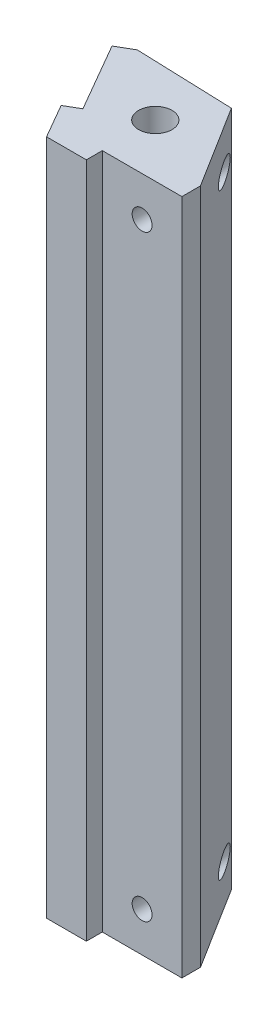
ISO-10303-21;
HEADER;
FILE_DESCRIPTION(('STEP AP214'),'2;1');
FILE_NAME('part.step','',(''),(''),'','','');
FILE_SCHEMA(('AUTOMOTIVE_DESIGN { 1 0 10303 214 1 1 1 1 }'));
ENDSEC;
DATA;
#1=APPLICATION_CONTEXT('core data for automotive mechanical design processes');
#2=APPLICATION_PROTOCOL_DEFINITION('international standard','automotive_design',2000,#1);
#3=PRODUCT_CONTEXT('',#1,'mechanical');
#4=PRODUCT('Part','Part','',(#3));
#5=PRODUCT_RELATED_PRODUCT_CATEGORY('part','',(#4));
#6=PRODUCT_DEFINITION_FORMATION('','',#4);
#7=PRODUCT_DEFINITION_CONTEXT('part definition',#1,'design');
#8=PRODUCT_DEFINITION('design','',#6,#7);
#9=PRODUCT_DEFINITION_SHAPE('','',#8);
#10=(LENGTH_UNIT() NAMED_UNIT(*) SI_UNIT(.MILLI.,.METRE.));
#11=(NAMED_UNIT(*) PLANE_ANGLE_UNIT() SI_UNIT($,.RADIAN.));
#12=(NAMED_UNIT(*) SI_UNIT($,.STERADIAN.) SOLID_ANGLE_UNIT());
#13=UNCERTAINTY_MEASURE_WITH_UNIT(LENGTH_MEASURE(1.E-05),#10,'distance_accuracy_value','');
#14=(GEOMETRIC_REPRESENTATION_CONTEXT(3) GLOBAL_UNCERTAINTY_ASSIGNED_CONTEXT((#13)) GLOBAL_UNIT_ASSIGNED_CONTEXT((#10,
#11,#12)) REPRESENTATION_CONTEXT('',''));
#15=CARTESIAN_POINT('',(0.,0.,0.));
#16=DIRECTION('',(0.,0.,1.));
#17=DIRECTION('',(1.,0.,0.));
#18=AXIS2_PLACEMENT_3D('',#15,#16,#17);
#19=CARTESIAN_POINT('',(0.,85.,0.));
#20=DIRECTION('',(0.866025403784436,0.,-0.500000000000004));
#21=DIRECTION('',(-0.500000000000004,0.,-0.866025403784436));
#22=AXIS2_PLACEMENT_3D('',#19,#20,#21);
#23=PLANE('',#22);
#24=DIRECTION('',(0.500000000000004,0.,0.866025403784436));
#25=VECTOR('',#24,1.);
#26=CARTESIAN_POINT('',(0.,85.,0.));
#27=LINE('',#26,#25);
#28=CARTESIAN_POINT('',(-2.50000000000031,85.,-4.3301270189223));
#29=VERTEX_POINT('',#28);
#30=CARTESIAN_POINT('',(0.,85.,0.));
#31=VERTEX_POINT('',#30);
#32=EDGE_CURVE('E217',#29,#31,#27,.T.);
#33=ORIENTED_EDGE('',*,*,#32,.F.);
#34=DIRECTION('',(0.,1.,0.));
#35=VECTOR('',#34,1.);
#36=CARTESIAN_POINT('',(-2.50000000000031,0.,-4.3301270189223));
#37=LINE('',#36,#35);
#38=CARTESIAN_POINT('',(-2.50000000000031,0.,-4.3301270189223));
#39=VERTEX_POINT('',#38);
#40=EDGE_CURVE('E201',#39,#29,#37,.T.);
#41=ORIENTED_EDGE('',*,*,#40,.F.);
#42=DIRECTION('',(0.500000000000004,0.,0.866025403784436));
#43=VECTOR('',#42,1.);
#44=CARTESIAN_POINT('',(0.,0.,0.));
#45=LINE('',#44,#43);
#46=CARTESIAN_POINT('',(0.,0.,0.));
#47=VERTEX_POINT('',#46);
#48=EDGE_CURVE('E211',#39,#47,#45,.T.);
#49=ORIENTED_EDGE('',*,*,#48,.T.);
#50=DIRECTION('',(0.,-1.,0.));
#51=VECTOR('',#50,1.);
#52=CARTESIAN_POINT('',(0.,85.,0.));
#53=LINE('',#52,#51);
#54=EDGE_CURVE('E13',#31,#47,#53,.T.);
#55=ORIENTED_EDGE('',*,*,#54,.F.);
#56=EDGE_LOOP('',(#33,#41,#49,#55));
#57=FACE_BOUND('',#56,.T.);
#58=ADVANCED_FACE('F60',(#57),#23,.F.);
#59=CARTESIAN_POINT('',(0.,85.,0.));
#60=DIRECTION('',(0.,0.,-1.));
#61=DIRECTION('',(-1.,0.,0.));
#62=AXIS2_PLACEMENT_3D('',#59,#60,#61);
#63=PLANE('',#62);
#64=DIRECTION('',(1.,0.,0.));
#65=VECTOR('',#64,1.);
#66=CARTESIAN_POINT('',(0.,0.,0.));
#67=LINE('',#66,#65);
#68=CARTESIAN_POINT('',(5.,0.,0.));
#69=VERTEX_POINT('',#68);
#70=EDGE_CURVE('E241',#47,#69,#67,.T.);
#71=ORIENTED_EDGE('',*,*,#70,.T.);
#72=DIRECTION('',(0.,1.,0.));
#73=VECTOR('',#72,1.);
#74=CARTESIAN_POINT('',(5.,0.,0.));
#75=LINE('',#74,#73);
#76=CARTESIAN_POINT('',(5.,85.,0.));
#77=VERTEX_POINT('',#76);
#78=EDGE_CURVE('E184',#69,#77,#75,.T.);
#79=ORIENTED_EDGE('',*,*,#78,.T.);
#80=DIRECTION('',(1.,0.,0.));
#81=VECTOR('',#80,1.);
#82=CARTESIAN_POINT('',(0.,85.,0.));
#83=LINE('',#82,#81);
#84=EDGE_CURVE('E220',#31,#77,#83,.T.);
#85=ORIENTED_EDGE('',*,*,#84,.F.);
#86=ORIENTED_EDGE('',*,*,#54,.T.);
#87=EDGE_LOOP('',(#71,#79,#85,#86));
#88=FACE_BOUND('',#87,.T.);
#89=ADVANCED_FACE('F300',(#88),#63,.F.);
#90=CARTESIAN_POINT('',(15.,85.,0.));
#91=DIRECTION('',(-1.,0.,0.));
#92=DIRECTION('',(0.,0.,1.));
#93=AXIS2_PLACEMENT_3D('',#90,#91,#92);
#94=PLANE('',#93);
#95=DIRECTION('',(0.,0.,-1.));
#96=VECTOR('',#95,1.);
#97=CARTESIAN_POINT('',(15.,85.,0.));
#98=LINE('',#97,#96);
#99=CARTESIAN_POINT('',(15.,85.,-2.));
#100=VERTEX_POINT('',#99);
#101=CARTESIAN_POINT('',(15.,85.,-4.3301270189222));
#102=VERTEX_POINT('',#101);
#103=EDGE_CURVE('E225',#100,#102,#98,.T.);
#104=ORIENTED_EDGE('',*,*,#103,.F.);
#105=DIRECTION('',(0.,1.,0.));
#106=VECTOR('',#105,1.);
#107=CARTESIAN_POINT('',(15.,0.,-2.));
#108=LINE('',#107,#106);
#109=CARTESIAN_POINT('',(15.,0.,-2.));
#110=VERTEX_POINT('',#109);
#111=EDGE_CURVE('E178',#110,#100,#108,.T.);
#112=ORIENTED_EDGE('',*,*,#111,.F.);
#113=DIRECTION('',(0.,0.,-1.));
#114=VECTOR('',#113,1.);
#115=CARTESIAN_POINT('',(15.,0.,0.));
#116=LINE('',#115,#114);
#117=CARTESIAN_POINT('',(15.,0.,-4.3301270189222));
#118=VERTEX_POINT('',#117);
#119=EDGE_CURVE('E245',#110,#118,#116,.T.);
#120=ORIENTED_EDGE('',*,*,#119,.T.);
#121=DIRECTION('',(0.,-1.,0.));
#122=VECTOR('',#121,1.);
#123=CARTESIAN_POINT('',(15.,85.,-4.3301270189222));
#124=LINE('',#123,#122);
#125=EDGE_CURVE('E69',#102,#118,#124,.T.);
#126=ORIENTED_EDGE('',*,*,#125,.F.);
#127=EDGE_LOOP('',(#104,#112,#120,#126));
#128=FACE_BOUND('',#127,.T.);
#129=ADVANCED_FACE('F294',(#128),#94,.F.);
#130=CARTESIAN_POINT('',(8.49999999999996,85.,-14.7224318643355));
#131=DIRECTION('',(-0.847821913300318,0.,0.530281060691204));
#132=DIRECTION('',(0.530281060691204,0.,0.847821913300318));
#133=AXIS2_PLACEMENT_3D('',#130,#131,#132);
#134=PLANE('',#133);
#135=CARTESIAN_POINT('',(10.,80.,-12.3242076692401));
#136=DIRECTION('',(-0.847821913300318,0.,0.530281060691204));
#137=DIRECTION('',(0.530281060691204,0.,0.847821913300318));
#138=AXIS2_PLACEMENT_3D('',#135,#136,#137);
#139=ELLIPSE('',#138,2.35724051387138,1.24999999999999);
#140=CARTESIAN_POINT('',(11.25,80.,-10.3256875066606));
#141=VERTEX_POINT('',#140);
#142=EDGE_CURVE('E373',#141,#141,#139,.T.);
#143=ORIENTED_EDGE('',*,*,#142,.T.);
#144=EDGE_LOOP('',(#143));
#145=FACE_BOUND('',#144,.T.);
#146=CARTESIAN_POINT('',(10.,5.,-12.3242076692401));
#147=DIRECTION('',(-0.847821913300318,0.,0.530281060691204));
#148=DIRECTION('',(0.530281060691204,0.,0.847821913300318));
#149=AXIS2_PLACEMENT_3D('',#146,#147,#148);
#150=ELLIPSE('',#149,2.35724051387138,1.24999999999999);
#151=CARTESIAN_POINT('',(11.25,5.,-10.3256875066606));
#152=VERTEX_POINT('',#151);
#153=EDGE_CURVE('E372',#152,#152,#150,.T.);
#154=ORIENTED_EDGE('',*,*,#153,.T.);
#155=EDGE_LOOP('',(#154));
#156=FACE_BOUND('',#155,.T.);
#157=DIRECTION('',(-0.530281060691204,0.,-0.847821913300318));
#158=VECTOR('',#157,1.);
#159=CARTESIAN_POINT('',(8.49999999999996,0.,-14.7224318643355));
#160=LINE('',#159,#158);
#161=CARTESIAN_POINT('',(8.49999999999996,0.,-14.7224318643355));
#162=VERTEX_POINT('',#161);
#163=EDGE_CURVE('E248',#118,#162,#160,.T.);
#164=ORIENTED_EDGE('',*,*,#163,.T.);
#165=DIRECTION('',(0.,-1.,0.));
#166=VECTOR('',#165,1.);
#167=CARTESIAN_POINT('',(8.49999999999996,85.,-14.7224318643355));
#168=LINE('',#167,#166);
#169=CARTESIAN_POINT('',(8.49999999999996,85.,-14.7224318643355));
#170=VERTEX_POINT('',#169);
#171=EDGE_CURVE('E260',#170,#162,#168,.T.);
#172=ORIENTED_EDGE('',*,*,#171,.F.);
#173=DIRECTION('',(-0.530281060691204,0.,-0.847821913300318));
#174=VECTOR('',#173,1.);
#175=CARTESIAN_POINT('',(8.49999999999996,85.,-14.7224318643355));
#176=LINE('',#175,#174);
#177=EDGE_CURVE('E228',#102,#170,#176,.T.);
#178=ORIENTED_EDGE('',*,*,#177,.F.);
#179=ORIENTED_EDGE('',*,*,#125,.T.);
#180=EDGE_LOOP('',(#164,#172,#178,#179));
#181=FACE_BOUND('',#180,.T.);
#182=ADVANCED_FACE('F271',(#145,#156,#181),#134,.F.);
#183=CARTESIAN_POINT('',(-3.75000000000006,85.,-15.1554445662277));
#184=DIRECTION('',(-0.0353259130541768,0.,0.999375845148805));
#185=DIRECTION('',(0.999375845148805,0.,0.0353259130541768));
#186=AXIS2_PLACEMENT_3D('',#183,#184,#185);
#187=PLANE('',#186);
#188=CARTESIAN_POINT('',(5.67307692307649,80.,-14.8223578724645));
#189=DIRECTION('',(-0.0353259130541768,0.,0.999375845148805));
#190=DIRECTION('',(-0.999375845148805,0.,-0.0353259130541768));
#191=AXIS2_PLACEMENT_3D('',#188,#189,#190);
#192=ELLIPSE('',#191,2.3572405138714,1.24999999999999);
#193=CARTESIAN_POINT('',(3.31730769230726,80.,-14.9056295459053));
#194=VERTEX_POINT('',#193);
#195=EDGE_CURVE('E389',#194,#194,#192,.T.);
#196=ORIENTED_EDGE('',*,*,#195,.T.);
#197=EDGE_LOOP('',(#196));
#198=FACE_BOUND('',#197,.T.);
#199=CARTESIAN_POINT('',(5.67307692307649,5.,-14.8223578724645));
#200=DIRECTION('',(-0.0353259130541768,0.,0.999375845148805));
#201=DIRECTION('',(-0.999375845148805,0.,-0.0353259130541768));
#202=AXIS2_PLACEMENT_3D('',#199,#200,#201);
#203=ELLIPSE('',#202,2.35724051387139,1.24999999999999);
#204=CARTESIAN_POINT('',(3.31730769230726,5.,-14.9056295459053));
#205=VERTEX_POINT('',#204);
#206=EDGE_CURVE('E63',#205,#205,#203,.T.);
#207=ORIENTED_EDGE('',*,*,#206,.T.);
#208=EDGE_LOOP('',(#207));
#209=FACE_BOUND('',#208,.T.);
#210=DIRECTION('',(-0.999375845148805,0.,-0.0353259130541768));
#211=VECTOR('',#210,1.);
#212=CARTESIAN_POINT('',(-3.75000000000006,0.,-15.1554445662277));
#213=LINE('',#212,#211);
#214=CARTESIAN_POINT('',(-3.75000000000006,0.,-15.1554445662277));
#215=VERTEX_POINT('',#214);
#216=EDGE_CURVE('E251',#162,#215,#213,.T.);
#217=ORIENTED_EDGE('',*,*,#216,.T.);
#218=DIRECTION('',(0.,-1.,0.));
#219=VECTOR('',#218,1.);
#220=CARTESIAN_POINT('',(-3.75000000000006,85.,-15.1554445662277));
#221=LINE('',#220,#219);
#222=CARTESIAN_POINT('',(-3.75000000000006,85.,-15.1554445662277));
#223=VERTEX_POINT('',#222);
#224=EDGE_CURVE('E238',#223,#215,#221,.T.);
#225=ORIENTED_EDGE('',*,*,#224,.F.);
#226=DIRECTION('',(-0.999375845148805,0.,-0.0353259130541768));
#227=VECTOR('',#226,1.);
#228=CARTESIAN_POINT('',(-3.75000000000006,85.,-15.1554445662277));
#229=LINE('',#228,#227);
#230=EDGE_CURVE('E231',#170,#223,#229,.T.);
#231=ORIENTED_EDGE('',*,*,#230,.F.);
#232=ORIENTED_EDGE('',*,*,#171,.T.);
#233=EDGE_LOOP('',(#217,#225,#231,#232));
#234=FACE_BOUND('',#233,.T.);
#235=ADVANCED_FACE('F282',(#198,#209,#234),#187,.F.);
#236=CARTESIAN_POINT('',(-3.75000000000006,85.,-15.1554445662277));
#237=DIRECTION('',(0.500000000000015,0.,0.86602540378443));
#238=DIRECTION('',(0.86602540378443,0.,-0.500000000000015));
#239=AXIS2_PLACEMENT_3D('',#236,#237,#238);
#240=PLANE('',#239);
#241=DIRECTION('',(-0.86602540378443,0.,0.500000000000015));
#242=VECTOR('',#241,1.);
#243=CARTESIAN_POINT('',(-3.75000000000006,0.,-15.1554445662277));
#244=LINE('',#243,#242);
#245=CARTESIAN_POINT('',(-5.76794919243139,0.,-13.9903810567666));
#246=VERTEX_POINT('',#245);
#247=EDGE_CURVE('E221',#215,#246,#244,.T.);
#248=ORIENTED_EDGE('',*,*,#247,.T.);
#249=DIRECTION('',(0.,1.,0.));
#250=VECTOR('',#249,1.);
#251=CARTESIAN_POINT('',(-5.76794919243139,0.,-13.9903810567666));
#252=LINE('',#251,#250);
#253=CARTESIAN_POINT('',(-5.76794919243139,85.,-13.9903810567666));
#254=VERTEX_POINT('',#253);
#255=EDGE_CURVE('E207',#246,#254,#252,.T.);
#256=ORIENTED_EDGE('',*,*,#255,.T.);
#257=DIRECTION('',(-0.86602540378443,0.,0.500000000000015));
#258=VECTOR('',#257,1.);
#259=CARTESIAN_POINT('',(-3.75000000000006,85.,-15.1554445662277));
#260=LINE('',#259,#258);
#261=EDGE_CURVE('E234',#223,#254,#260,.T.);
#262=ORIENTED_EDGE('',*,*,#261,.F.);
#263=ORIENTED_EDGE('',*,*,#224,.T.);
#264=EDGE_LOOP('',(#248,#256,#262,#263));
#265=FACE_BOUND('',#264,.T.);
#266=ADVANCED_FACE('F286',(#265),#240,.F.);
#267=CARTESIAN_POINT('',(0.,85.,0.));
#268=DIRECTION('',(0.,1.,0.));
#269=DIRECTION('',(0.,0.,1.));
#270=AXIS2_PLACEMENT_3D('',#267,#268,#269);
#271=PLANE('',#270);
#272=CARTESIAN_POINT('',(4.99999999999998,85.,-8.6602540378444));
#273=DIRECTION('',(0.,1.,0.));
#274=DIRECTION('',(0.,0.,1.));
#275=AXIS2_PLACEMENT_3D('',#272,#273,#274);
#276=CIRCLE('',#275,2.09999999999999);
#277=CARTESIAN_POINT('',(4.99999999999998,85.,-6.56025403784441));
#278=VERTEX_POINT('',#277);
#279=EDGE_CURVE('E155',#278,#278,#276,.T.);
#280=ORIENTED_EDGE('',*,*,#279,.F.);
#281=EDGE_LOOP('',(#280));
#282=FACE_BOUND('',#281,.T.);
#283=DIRECTION('',(0.,0.,1.));
#284=VECTOR('',#283,1.);
#285=CARTESIAN_POINT('',(5.,85.,-2.));
#286=LINE('',#285,#284);
#287=CARTESIAN_POINT('',(5.,85.,-2.));
#288=VERTEX_POINT('',#287);
#289=EDGE_CURVE('E175',#288,#77,#286,.T.);
#290=ORIENTED_EDGE('',*,*,#289,.F.);
#291=DIRECTION('',(-1.,0.,0.));
#292=VECTOR('',#291,1.);
#293=CARTESIAN_POINT('',(15.,85.,-2.));
#294=LINE('',#293,#292);
#295=EDGE_CURVE('E170',#100,#288,#294,.T.);
#296=ORIENTED_EDGE('',*,*,#295,.F.);
#297=ORIENTED_EDGE('',*,*,#103,.T.);
#298=ORIENTED_EDGE('',*,*,#177,.T.);
#299=ORIENTED_EDGE('',*,*,#230,.T.);
#300=ORIENTED_EDGE('',*,*,#261,.T.);
#301=DIRECTION('',(-0.5,0.,-0.866025403784439));
#302=VECTOR('',#301,1.);
#303=CARTESIAN_POINT('',(-5.76794919243139,85.,-13.9903810567666));
#304=LINE('',#303,#302);
#305=CARTESIAN_POINT('',(-0.767949192431417,85.,-5.33012701892222));
#306=VERTEX_POINT('',#305);
#307=EDGE_CURVE('E198',#306,#254,#304,.T.);
#308=ORIENTED_EDGE('',*,*,#307,.F.);
#309=DIRECTION('',(0.866025403784457,0.,-0.499999999999969));
#310=VECTOR('',#309,1.);
#311=CARTESIAN_POINT('',(-0.767949192431417,85.,-5.33012701892222));
#312=LINE('',#311,#310);
#313=EDGE_CURVE('E188',#29,#306,#312,.T.);
#314=ORIENTED_EDGE('',*,*,#313,.F.);
#315=ORIENTED_EDGE('',*,*,#32,.T.);
#316=ORIENTED_EDGE('',*,*,#84,.T.);
#317=EDGE_LOOP('',(#290,#296,#297,#298,#299,#300,#308,#314,#315,#316));
#318=FACE_BOUND('',#317,.T.);
#319=ADVANCED_FACE('F290',(#282,#318),#271,.T.);
#320=CARTESIAN_POINT('',(0.,0.,0.));
#321=DIRECTION('',(0.,1.,0.));
#322=DIRECTION('',(0.,0.,1.));
#323=AXIS2_PLACEMENT_3D('',#320,#321,#322);
#324=PLANE('',#323);
#325=CARTESIAN_POINT('',(4.99999999999998,0.,-8.6602540378444));
#326=DIRECTION('',(0.,-1.,0.));
#327=DIRECTION('',(0.,0.,-1.));
#328=AXIS2_PLACEMENT_3D('',#325,#326,#327);
#329=CIRCLE('',#328,2.09999999999999);
#330=CARTESIAN_POINT('',(4.99999999999998,0.,-10.7602540378444));
#331=VERTEX_POINT('',#330);
#332=EDGE_CURVE('E156',#331,#331,#329,.T.);
#333=ORIENTED_EDGE('',*,*,#332,.F.);
#334=EDGE_LOOP('',(#333));
#335=FACE_BOUND('',#334,.T.);
#336=DIRECTION('',(-1.,0.,0.));
#337=VECTOR('',#336,1.);
#338=CARTESIAN_POINT('',(15.,0.,-2.));
#339=LINE('',#338,#337);
#340=CARTESIAN_POINT('',(5.,0.,-2.));
#341=VERTEX_POINT('',#340);
#342=EDGE_CURVE('E171',#110,#341,#339,.T.);
#343=ORIENTED_EDGE('',*,*,#342,.T.);
#344=DIRECTION('',(0.,0.,1.));
#345=VECTOR('',#344,1.);
#346=CARTESIAN_POINT('',(5.,0.,-2.));
#347=LINE('',#346,#345);
#348=EDGE_CURVE('E76',#341,#69,#347,.T.);
#349=ORIENTED_EDGE('',*,*,#348,.T.);
#350=ORIENTED_EDGE('',*,*,#70,.F.);
#351=ORIENTED_EDGE('',*,*,#48,.F.);
#352=DIRECTION('',(0.866025403784457,0.,-0.499999999999969));
#353=VECTOR('',#352,1.);
#354=CARTESIAN_POINT('',(-0.767949192431417,0.,-5.33012701892222));
#355=LINE('',#354,#353);
#356=CARTESIAN_POINT('',(-0.767949192431417,0.,-5.33012701892222));
#357=VERTEX_POINT('',#356);
#358=EDGE_CURVE('E194',#39,#357,#355,.T.);
#359=ORIENTED_EDGE('',*,*,#358,.T.);
#360=DIRECTION('',(-0.5,0.,-0.866025403784439));
#361=VECTOR('',#360,1.);
#362=CARTESIAN_POINT('',(-5.76794919243139,0.,-13.9903810567666));
#363=LINE('',#362,#361);
#364=EDGE_CURVE('E84',#357,#246,#363,.T.);
#365=ORIENTED_EDGE('',*,*,#364,.T.);
#366=ORIENTED_EDGE('',*,*,#247,.F.);
#367=ORIENTED_EDGE('',*,*,#216,.F.);
#368=ORIENTED_EDGE('',*,*,#163,.F.);
#369=ORIENTED_EDGE('',*,*,#119,.F.);
#370=EDGE_LOOP('',(#343,#349,#350,#351,#359,#365,#366,#367,#368,#369));
#371=FACE_BOUND('',#370,.T.);
#372=ADVANCED_FACE('F278',(#335,#371),#324,.F.);
#373=CARTESIAN_POINT('',(-5.76794919243139,0.,-13.9903810567666));
#374=DIRECTION('',(0.866025403784439,0.,-0.5));
#375=DIRECTION('',(-0.5,0.,-0.866025403784439));
#376=AXIS2_PLACEMENT_3D('',#373,#374,#375);
#377=PLANE('',#376);
#378=CARTESIAN_POINT('',(-3.26794919243145,80.,-9.66025403784447));
#379=DIRECTION('',(-0.866025403784439,0.,0.5));
#380=DIRECTION('',(0.5,0.,0.866025403784439));
#381=AXIS2_PLACEMENT_3D('',#378,#379,#380);
#382=CIRCLE('',#381,1.24999999999999);
#383=CARTESIAN_POINT('',(-2.64294919243146,80.,-8.57772228311394));
#384=VERTEX_POINT('',#383);
#385=EDGE_CURVE('E379',#384,#384,#382,.T.);
#386=ORIENTED_EDGE('',*,*,#385,.F.);
#387=EDGE_LOOP('',(#386));
#388=FACE_BOUND('',#387,.T.);
#389=CARTESIAN_POINT('',(-3.26794919243145,5.,-9.66025403784447));
#390=DIRECTION('',(-0.866025403784439,0.,0.5));
#391=DIRECTION('',(0.5,0.,0.866025403784439));
#392=AXIS2_PLACEMENT_3D('',#389,#390,#391);
#393=CIRCLE('',#392,1.24999999999999);
#394=CARTESIAN_POINT('',(-2.64294919243146,5.,-8.57772228311394));
#395=VERTEX_POINT('',#394);
#396=EDGE_CURVE('E392',#395,#395,#393,.T.);
#397=ORIENTED_EDGE('',*,*,#396,.F.);
#398=EDGE_LOOP('',(#397));
#399=FACE_BOUND('',#398,.T.);
#400=ORIENTED_EDGE('',*,*,#307,.T.);
#401=ORIENTED_EDGE('',*,*,#255,.F.);
#402=ORIENTED_EDGE('',*,*,#364,.F.);
#403=DIRECTION('',(0.,1.,0.));
#404=VECTOR('',#403,1.);
#405=CARTESIAN_POINT('',(-0.767949192431417,0.,-5.33012701892222));
#406=LINE('',#405,#404);
#407=EDGE_CURVE('E212',#357,#306,#406,.T.);
#408=ORIENTED_EDGE('',*,*,#407,.T.);
#409=EDGE_LOOP('',(#400,#401,#402,#408));
#410=FACE_BOUND('',#409,.T.);
#411=ADVANCED_FACE('F308',(#388,#399,#410),#377,.F.);
#412=CARTESIAN_POINT('',(-0.767949192431417,0.,-5.33012701892222));
#413=DIRECTION('',(0.499999999999968,0.,0.866025403784457));
#414=DIRECTION('',(0.866025403784457,0.,-0.499999999999969));
#415=AXIS2_PLACEMENT_3D('',#412,#413,#414);
#416=PLANE('',#415);
#417=ORIENTED_EDGE('',*,*,#313,.T.);
#418=ORIENTED_EDGE('',*,*,#407,.F.);
#419=ORIENTED_EDGE('',*,*,#358,.F.);
#420=ORIENTED_EDGE('',*,*,#40,.T.);
#421=EDGE_LOOP('',(#417,#418,#419,#420));
#422=FACE_BOUND('',#421,.T.);
#423=ADVANCED_FACE('F307',(#422),#416,.F.);
#424=CARTESIAN_POINT('',(5.,0.,-2.));
#425=DIRECTION('',(-1.,0.,0.));
#426=DIRECTION('',(0.,0.,1.));
#427=AXIS2_PLACEMENT_3D('',#424,#425,#426);
#428=PLANE('',#427);
#429=ORIENTED_EDGE('',*,*,#289,.T.);
#430=ORIENTED_EDGE('',*,*,#78,.F.);
#431=ORIENTED_EDGE('',*,*,#348,.F.);
#432=DIRECTION('',(0.,1.,0.));
#433=VECTOR('',#432,1.);
#434=CARTESIAN_POINT('',(5.,0.,-2.));
#435=LINE('',#434,#433);
#436=EDGE_CURVE('E189',#341,#288,#435,.T.);
#437=ORIENTED_EDGE('',*,*,#436,.T.);
#438=EDGE_LOOP('',(#429,#430,#431,#437));
#439=FACE_BOUND('',#438,.T.);
#440=ADVANCED_FACE('F316',(#439),#428,.F.);
#441=CARTESIAN_POINT('',(15.,0.,-2.));
#442=DIRECTION('',(0.,0.,-1.));
#443=DIRECTION('',(-1.,0.,0.));
#444=AXIS2_PLACEMENT_3D('',#441,#442,#443);
#445=PLANE('',#444);
#446=CARTESIAN_POINT('',(10.,80.,-2.));
#447=DIRECTION('',(0.,0.,1.));
#448=DIRECTION('',(1.,0.,0.));
#449=AXIS2_PLACEMENT_3D('',#446,#447,#448);
#450=CIRCLE('',#449,1.24999999999999);
#451=CARTESIAN_POINT('',(11.25,80.,-2.));
#452=VERTEX_POINT('',#451);
#453=EDGE_CURVE('E366',#452,#452,#450,.T.);
#454=ORIENTED_EDGE('',*,*,#453,.F.);
#455=EDGE_LOOP('',(#454));
#456=FACE_BOUND('',#455,.T.);
#457=CARTESIAN_POINT('',(10.,5.,-2.));
#458=DIRECTION('',(0.,0.,1.));
#459=DIRECTION('',(1.,0.,0.));
#460=AXIS2_PLACEMENT_3D('',#457,#458,#459);
#461=CIRCLE('',#460,1.24999999999999);
#462=CARTESIAN_POINT('',(11.25,5.,-2.));
#463=VERTEX_POINT('',#462);
#464=EDGE_CURVE('E369',#463,#463,#461,.T.);
#465=ORIENTED_EDGE('',*,*,#464,.F.);
#466=EDGE_LOOP('',(#465));
#467=FACE_BOUND('',#466,.T.);
#468=ORIENTED_EDGE('',*,*,#295,.T.);
#469=ORIENTED_EDGE('',*,*,#436,.F.);
#470=ORIENTED_EDGE('',*,*,#342,.F.);
#471=ORIENTED_EDGE('',*,*,#111,.T.);
#472=EDGE_LOOP('',(#468,#469,#470,#471));
#473=FACE_BOUND('',#472,.T.);
#474=ADVANCED_FACE('F296',(#456,#467,#473),#445,.F.);
#475=CARTESIAN_POINT('',(4.99999999999998,69.,-8.6602540378444));
#476=DIRECTION('',(0.,1.,0.));
#477=DIRECTION('',(0.,0.,1.));
#478=AXIS2_PLACEMENT_3D('',#475,#476,#477);
#479=CONICAL_SURFACE('',#478,2.1,1.02974425867665);
#480=CARTESIAN_POINT('',(4.99999999999998,67.7381927000421,-8.6602540378444));
#481=VERTEX_POINT('',#480);
#482=VERTEX_LOOP('',#481);
#483=FACE_BOUND('',#482,.T.);
#484=CARTESIAN_POINT('',(4.99999999999998,69.,-8.6602540378444));
#485=DIRECTION('',(0.,1.,0.));
#486=DIRECTION('',(0.,0.,1.));
#487=AXIS2_PLACEMENT_3D('',#484,#485,#486);
#488=CIRCLE('',#487,2.1);
#489=CARTESIAN_POINT('',(4.99999999999998,69.,-6.5602540378444));
#490=VERTEX_POINT('',#489);
#491=EDGE_CURVE('E161',#490,#490,#488,.T.);
#492=ORIENTED_EDGE('',*,*,#491,.T.);
#493=EDGE_LOOP('',(#492));
#494=FACE_BOUND('',#493,.T.);
#495=ADVANCED_FACE('F347',(#483,#494),#479,.F.);
#496=CARTESIAN_POINT('',(4.99999999999998,85.,-8.6602540378444));
#497=DIRECTION('',(0.,1.,0.));
#498=DIRECTION('',(0.,0.,1.));
#499=AXIS2_PLACEMENT_3D('',#496,#497,#498);
#500=CYLINDRICAL_SURFACE('',#499,2.09999999999999);
#501=ORIENTED_EDGE('',*,*,#491,.F.);
#502=EDGE_LOOP('',(#501));
#503=FACE_BOUND('',#502,.T.);
#504=ORIENTED_EDGE('',*,*,#279,.T.);
#505=EDGE_LOOP('',(#504));
#506=FACE_BOUND('',#505,.T.);
#507=ADVANCED_FACE('F148',(#503,#506),#500,.F.);
#508=CARTESIAN_POINT('',(4.99999999999998,16.4,-8.6602540378444));
#509=DIRECTION('',(0.,-1.,0.));
#510=DIRECTION('',(0.,0.,-1.));
#511=AXIS2_PLACEMENT_3D('',#508,#509,#510);
#512=CONICAL_SURFACE('',#511,2.1,1.02974425867665);
#513=CARTESIAN_POINT('',(4.99999999999998,17.6618072999579,-8.6602540378444));
#514=VERTEX_POINT('',#513);
#515=VERTEX_LOOP('',#514);
#516=FACE_BOUND('',#515,.T.);
#517=CARTESIAN_POINT('',(4.99999999999998,16.4,-8.6602540378444));
#518=DIRECTION('',(0.,-1.,0.));
#519=DIRECTION('',(0.,0.,-1.));
#520=AXIS2_PLACEMENT_3D('',#517,#518,#519);
#521=CIRCLE('',#520,2.1);
#522=CARTESIAN_POINT('',(4.99999999999998,16.4,-10.7602540378444));
#523=VERTEX_POINT('',#522);
#524=EDGE_CURVE('E152',#523,#523,#521,.T.);
#525=ORIENTED_EDGE('',*,*,#524,.T.);
#526=EDGE_LOOP('',(#525));
#527=FACE_BOUND('',#526,.T.);
#528=ADVANCED_FACE('F144',(#516,#527),#512,.F.);
#529=CARTESIAN_POINT('',(4.99999999999998,0.,-8.6602540378444));
#530=DIRECTION('',(0.,-1.,0.));
#531=DIRECTION('',(0.,0.,-1.));
#532=AXIS2_PLACEMENT_3D('',#529,#530,#531);
#533=CYLINDRICAL_SURFACE('',#532,2.09999999999999);
#534=ORIENTED_EDGE('',*,*,#524,.F.);
#535=EDGE_LOOP('',(#534));
#536=FACE_BOUND('',#535,.T.);
#537=ORIENTED_EDGE('',*,*,#332,.T.);
#538=EDGE_LOOP('',(#537));
#539=FACE_BOUND('',#538,.T.);
#540=ADVANCED_FACE('F147',(#536,#539),#533,.F.);
#541=CARTESIAN_POINT('',(-3.26794919243145,5.,-9.66025403784447));
#542=DIRECTION('',(-0.866025403784439,0.,0.5));
#543=DIRECTION('',(0.5,0.,0.866025403784439));
#544=AXIS2_PLACEMENT_3D('',#541,#542,#543);
#545=CYLINDRICAL_SURFACE('',#544,1.24999999999999);
#546=ORIENTED_EDGE('',*,*,#396,.T.);
#547=EDGE_LOOP('',(#546));
#548=FACE_BOUND('',#547,.T.);
#549=ORIENTED_EDGE('',*,*,#206,.F.);
#550=EDGE_LOOP('',(#549));
#551=FACE_BOUND('',#550,.T.);
#552=ADVANCED_FACE('F400',(#548,#551),#545,.F.);
#553=CARTESIAN_POINT('',(-3.26794919243145,80.,-9.66025403784447));
#554=DIRECTION('',(-0.866025403784439,0.,0.5));
#555=DIRECTION('',(0.5,0.,0.866025403784439));
#556=AXIS2_PLACEMENT_3D('',#553,#554,#555);
#557=CYLINDRICAL_SURFACE('',#556,1.24999999999999);
#558=ORIENTED_EDGE('',*,*,#385,.T.);
#559=EDGE_LOOP('',(#558));
#560=FACE_BOUND('',#559,.T.);
#561=ORIENTED_EDGE('',*,*,#195,.F.);
#562=EDGE_LOOP('',(#561));
#563=FACE_BOUND('',#562,.T.);
#564=ADVANCED_FACE('F402',(#560,#563),#557,.F.);
#565=CARTESIAN_POINT('',(10.,5.,-2.));
#566=DIRECTION('',(0.,0.,1.));
#567=DIRECTION('',(1.,0.,0.));
#568=AXIS2_PLACEMENT_3D('',#565,#566,#567);
#569=CYLINDRICAL_SURFACE('',#568,1.24999999999999);
#570=ORIENTED_EDGE('',*,*,#464,.T.);
#571=EDGE_LOOP('',(#570));
#572=FACE_BOUND('',#571,.T.);
#573=ORIENTED_EDGE('',*,*,#153,.F.);
#574=EDGE_LOOP('',(#573));
#575=FACE_BOUND('',#574,.T.);
#576=ADVANCED_FACE('F408',(#572,#575),#569,.F.);
#577=CARTESIAN_POINT('',(10.,80.,-2.));
#578=DIRECTION('',(0.,0.,1.));
#579=DIRECTION('',(1.,0.,0.));
#580=AXIS2_PLACEMENT_3D('',#577,#578,#579);
#581=CYLINDRICAL_SURFACE('',#580,1.24999999999999);
#582=ORIENTED_EDGE('',*,*,#453,.T.);
#583=EDGE_LOOP('',(#582));
#584=FACE_BOUND('',#583,.T.);
#585=ORIENTED_EDGE('',*,*,#142,.F.);
#586=EDGE_LOOP('',(#585));
#587=FACE_BOUND('',#586,.T.);
#588=ADVANCED_FACE('F414',(#584,#587),#581,.F.);
#589=CLOSED_SHELL('',(#58,#89,#129,#182,#235,#266,#319,#372,#411,#423,#440,#474,#495,#507,#528,
#540,#552,#564,#576,#588));
#590=MANIFOLD_SOLID_BREP('B2',#589);
#591=ADVANCED_BREP_SHAPE_REPRESENTATION('',(#18,#590),#14);
#592=SHAPE_DEFINITION_REPRESENTATION(#9,#591);
ENDSEC;
END-ISO-10303-21;
